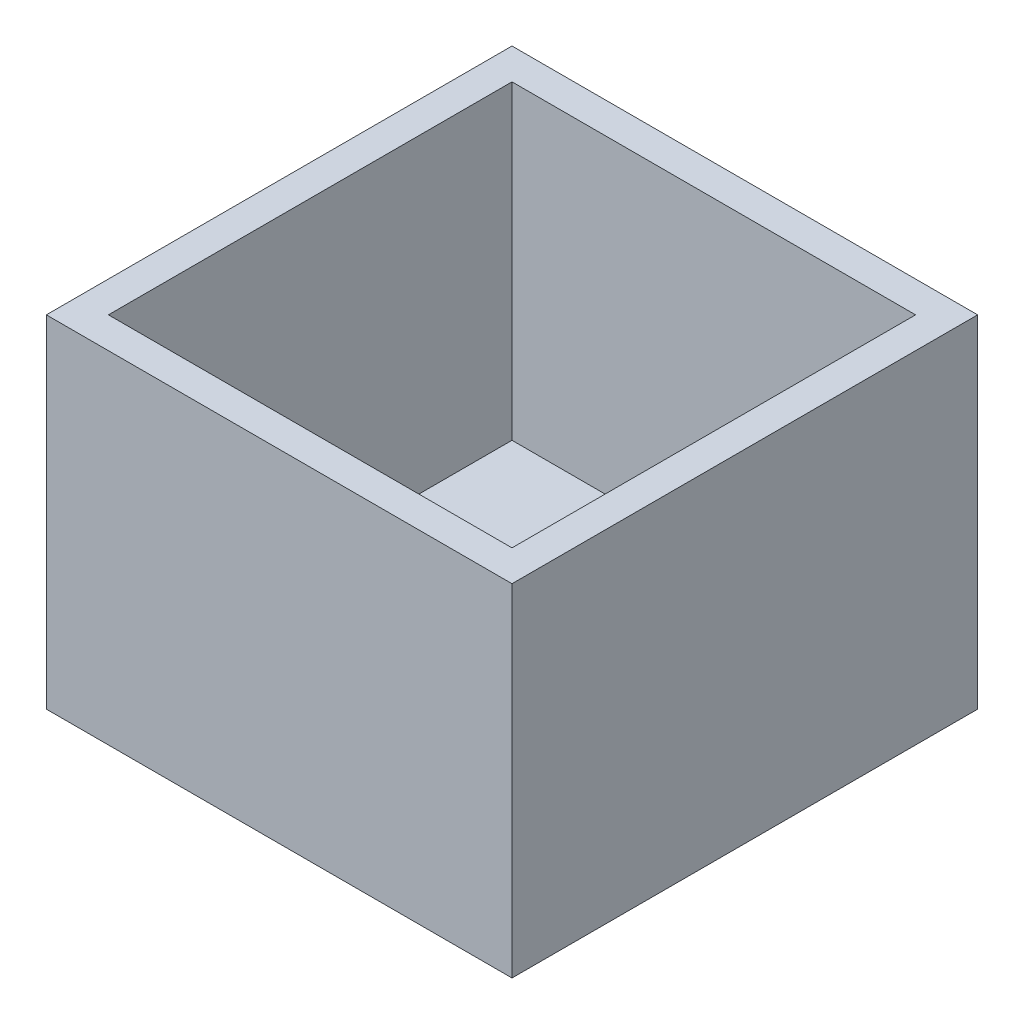
ISO-10303-21;
HEADER;
FILE_DESCRIPTION(('STEP AP214'),'2;1');
FILE_NAME('part.step','',(''),(''),'','','');
FILE_SCHEMA(('AUTOMOTIVE_DESIGN { 1 0 10303 214 1 1 1 1 }'));
ENDSEC;
DATA;
#1=APPLICATION_CONTEXT('core data for automotive mechanical design processes');
#2=APPLICATION_PROTOCOL_DEFINITION('international standard','automotive_design',2000,#1);
#3=PRODUCT_CONTEXT('',#1,'mechanical');
#4=PRODUCT('Part','Part','',(#3));
#5=PRODUCT_RELATED_PRODUCT_CATEGORY('part','',(#4));
#6=PRODUCT_DEFINITION_FORMATION('','',#4);
#7=PRODUCT_DEFINITION_CONTEXT('part definition',#1,'design');
#8=PRODUCT_DEFINITION('design','',#6,#7);
#9=PRODUCT_DEFINITION_SHAPE('','',#8);
#10=(LENGTH_UNIT() NAMED_UNIT(*) SI_UNIT(.MILLI.,.METRE.));
#11=(NAMED_UNIT(*) PLANE_ANGLE_UNIT() SI_UNIT($,.RADIAN.));
#12=(NAMED_UNIT(*) SI_UNIT($,.STERADIAN.) SOLID_ANGLE_UNIT());
#13=UNCERTAINTY_MEASURE_WITH_UNIT(LENGTH_MEASURE(1.E-05),#10,'distance_accuracy_value','');
#14=(GEOMETRIC_REPRESENTATION_CONTEXT(3) GLOBAL_UNCERTAINTY_ASSIGNED_CONTEXT((#13)) GLOBAL_UNIT_ASSIGNED_CONTEXT((#10,
#11,#12)) REPRESENTATION_CONTEXT('',''));
#15=CARTESIAN_POINT('',(0.,0.,0.));
#16=DIRECTION('',(0.,0.,1.));
#17=DIRECTION('',(1.,0.,0.));
#18=AXIS2_PLACEMENT_3D('',#15,#16,#17);
#19=CARTESIAN_POINT('',(0.,10.,0.));
#20=DIRECTION('',(0.,-1.,0.));
#21=DIRECTION('',(0.,0.,-1.));
#22=AXIS2_PLACEMENT_3D('',#19,#20,#21);
#23=PLANE('',#22);
#24=DIRECTION('',(0.,0.,-1.));
#25=VECTOR('',#24,1.);
#26=CARTESIAN_POINT('',(7.5,10.,7.5));
#27=LINE('',#26,#25);
#28=CARTESIAN_POINT('',(7.5,10.,7.5));
#29=VERTEX_POINT('',#28);
#30=CARTESIAN_POINT('',(7.5,10.,-7.5));
#31=VERTEX_POINT('',#30);
#32=EDGE_CURVE('E173',#29,#31,#27,.T.);
#33=ORIENTED_EDGE('',*,*,#32,.T.);
#34=DIRECTION('',(-1.,0.,0.));
#35=VECTOR('',#34,1.);
#36=CARTESIAN_POINT('',(-7.5,10.,-7.5));
#37=LINE('',#36,#35);
#38=CARTESIAN_POINT('',(-7.5,10.,-7.5));
#39=VERTEX_POINT('',#38);
#40=EDGE_CURVE('E111',#31,#39,#37,.T.);
#41=ORIENTED_EDGE('',*,*,#40,.T.);
#42=DIRECTION('',(0.,0.,1.));
#43=VECTOR('',#42,1.);
#44=CARTESIAN_POINT('',(-7.5,10.,7.5));
#45=LINE('',#44,#43);
#46=CARTESIAN_POINT('',(-7.5,10.,7.5));
#47=VERTEX_POINT('',#46);
#48=EDGE_CURVE('E178',#39,#47,#45,.T.);
#49=ORIENTED_EDGE('',*,*,#48,.T.);
#50=DIRECTION('',(1.,0.,0.));
#51=VECTOR('',#50,1.);
#52=CARTESIAN_POINT('',(-7.5,10.,7.5));
#53=LINE('',#52,#51);
#54=EDGE_CURVE('E181',#47,#29,#53,.T.);
#55=ORIENTED_EDGE('',*,*,#54,.T.);
#56=EDGE_LOOP('',(#33,#41,#49,#55));
#57=FACE_BOUND('',#56,.T.);
#58=DIRECTION('',(0.,0.,-1.));
#59=VECTOR('',#58,1.);
#60=CARTESIAN_POINT('',(6.5,10.,6.5));
#61=LINE('',#60,#59);
#62=CARTESIAN_POINT('',(6.5,10.,6.5));
#63=VERTEX_POINT('',#62);
#64=CARTESIAN_POINT('',(6.5,10.,-6.5));
#65=VERTEX_POINT('',#64);
#66=EDGE_CURVE('E136',#63,#65,#61,.T.);
#67=ORIENTED_EDGE('',*,*,#66,.F.);
#68=DIRECTION('',(1.,0.,0.));
#69=VECTOR('',#68,1.);
#70=CARTESIAN_POINT('',(-6.5,10.,6.5));
#71=LINE('',#70,#69);
#72=CARTESIAN_POINT('',(-6.5,10.,6.5));
#73=VERTEX_POINT('',#72);
#74=EDGE_CURVE('E146',#73,#63,#71,.T.);
#75=ORIENTED_EDGE('',*,*,#74,.F.);
#76=DIRECTION('',(0.,0.,1.));
#77=VECTOR('',#76,1.);
#78=CARTESIAN_POINT('',(-6.5,10.,6.5));
#79=LINE('',#78,#77);
#80=CARTESIAN_POINT('',(-6.5,10.,-6.5));
#81=VERTEX_POINT('',#80);
#82=EDGE_CURVE('E143',#81,#73,#79,.T.);
#83=ORIENTED_EDGE('',*,*,#82,.F.);
#84=DIRECTION('',(-1.,0.,0.));
#85=VECTOR('',#84,1.);
#86=CARTESIAN_POINT('',(-6.5,10.,-6.5));
#87=LINE('',#86,#85);
#88=EDGE_CURVE('E139',#65,#81,#87,.T.);
#89=ORIENTED_EDGE('',*,*,#88,.F.);
#90=EDGE_LOOP('',(#67,#75,#83,#89));
#91=FACE_BOUND('',#90,.T.);
#92=ADVANCED_FACE('F39',(#57,#91),#23,.F.);
#93=CARTESIAN_POINT('',(7.5,10.,7.5));
#94=DIRECTION('',(-1.,0.,0.));
#95=DIRECTION('',(0.,0.,1.));
#96=AXIS2_PLACEMENT_3D('',#93,#94,#95);
#97=PLANE('',#96);
#98=DIRECTION('',(0.,-1.,0.));
#99=VECTOR('',#98,1.);
#100=CARTESIAN_POINT('',(7.5,10.,7.5));
#101=LINE('',#100,#99);
#102=CARTESIAN_POINT('',(7.5,-1.,7.5));
#103=VERTEX_POINT('',#102);
#104=EDGE_CURVE('E118',#29,#103,#101,.T.);
#105=ORIENTED_EDGE('',*,*,#104,.T.);
#106=DIRECTION('',(0.,0.,-1.));
#107=VECTOR('',#106,1.);
#108=CARTESIAN_POINT('',(7.5,-1.,22.5332963783729));
#109=LINE('',#108,#107);
#110=CARTESIAN_POINT('',(7.5,-1.,-7.5));
#111=VERTEX_POINT('',#110);
#112=EDGE_CURVE('E116',#103,#111,#109,.T.);
#113=ORIENTED_EDGE('',*,*,#112,.T.);
#114=DIRECTION('',(0.,-1.,0.));
#115=VECTOR('',#114,1.);
#116=CARTESIAN_POINT('',(7.5,10.,-7.5));
#117=LINE('',#116,#115);
#118=EDGE_CURVE('E11',#31,#111,#117,.T.);
#119=ORIENTED_EDGE('',*,*,#118,.F.);
#120=ORIENTED_EDGE('',*,*,#32,.F.);
#121=EDGE_LOOP('',(#105,#113,#119,#120));
#122=FACE_BOUND('',#121,.T.);
#123=ADVANCED_FACE('F41',(#122),#97,.F.);
#124=CARTESIAN_POINT('',(-7.5,10.,-7.5));
#125=DIRECTION('',(0.,0.,1.));
#126=DIRECTION('',(1.,0.,0.));
#127=AXIS2_PLACEMENT_3D('',#124,#125,#126);
#128=PLANE('',#127);
#129=ORIENTED_EDGE('',*,*,#118,.T.);
#130=DIRECTION('',(-1.,0.,0.));
#131=VECTOR('',#130,1.);
#132=CARTESIAN_POINT('',(7.5,-1.,-7.5));
#133=LINE('',#132,#131);
#134=CARTESIAN_POINT('',(-7.5,-1.,-7.5));
#135=VERTEX_POINT('',#134);
#136=EDGE_CURVE('E110',#111,#135,#133,.T.);
#137=ORIENTED_EDGE('',*,*,#136,.T.);
#138=DIRECTION('',(0.,-1.,0.));
#139=VECTOR('',#138,1.);
#140=CARTESIAN_POINT('',(-7.5,10.,-7.5));
#141=LINE('',#140,#139);
#142=EDGE_CURVE('E48',#39,#135,#141,.T.);
#143=ORIENTED_EDGE('',*,*,#142,.F.);
#144=ORIENTED_EDGE('',*,*,#40,.F.);
#145=EDGE_LOOP('',(#129,#137,#143,#144));
#146=FACE_BOUND('',#145,.T.);
#147=ADVANCED_FACE('F107',(#146),#128,.F.);
#148=CARTESIAN_POINT('',(-7.5,10.,7.5));
#149=DIRECTION('',(1.,0.,0.));
#150=DIRECTION('',(0.,0.,-1.));
#151=AXIS2_PLACEMENT_3D('',#148,#149,#150);
#152=PLANE('',#151);
#153=ORIENTED_EDGE('',*,*,#142,.T.);
#154=DIRECTION('',(0.,0.,-1.));
#155=VECTOR('',#154,1.);
#156=CARTESIAN_POINT('',(-7.5,-1.,22.5332963783729));
#157=LINE('',#156,#155);
#158=CARTESIAN_POINT('',(-7.5,-1.,7.5));
#159=VERTEX_POINT('',#158);
#160=EDGE_CURVE('E123',#159,#135,#157,.T.);
#161=ORIENTED_EDGE('',*,*,#160,.F.);
#162=DIRECTION('',(0.,-1.,0.));
#163=VECTOR('',#162,1.);
#164=CARTESIAN_POINT('',(-7.5,10.,7.5));
#165=LINE('',#164,#163);
#166=EDGE_CURVE('E186',#47,#159,#165,.T.);
#167=ORIENTED_EDGE('',*,*,#166,.F.);
#168=ORIENTED_EDGE('',*,*,#48,.F.);
#169=EDGE_LOOP('',(#153,#161,#167,#168));
#170=FACE_BOUND('',#169,.T.);
#171=ADVANCED_FACE('F191',(#170),#152,.F.);
#172=CARTESIAN_POINT('',(-7.5,10.,7.5));
#173=DIRECTION('',(0.,0.,-1.));
#174=DIRECTION('',(-1.,0.,0.));
#175=AXIS2_PLACEMENT_3D('',#172,#173,#174);
#176=PLANE('',#175);
#177=ORIENTED_EDGE('',*,*,#166,.T.);
#178=DIRECTION('',(1.,0.,0.));
#179=VECTOR('',#178,1.);
#180=CARTESIAN_POINT('',(7.5,-1.,7.5));
#181=LINE('',#180,#179);
#182=EDGE_CURVE('E132',#159,#103,#181,.T.);
#183=ORIENTED_EDGE('',*,*,#182,.T.);
#184=ORIENTED_EDGE('',*,*,#104,.F.);
#185=ORIENTED_EDGE('',*,*,#54,.F.);
#186=EDGE_LOOP('',(#177,#183,#184,#185));
#187=FACE_BOUND('',#186,.T.);
#188=ADVANCED_FACE('F197',(#187),#176,.F.);
#189=CARTESIAN_POINT('',(6.5,10.,6.5));
#190=DIRECTION('',(-1.,0.,0.));
#191=DIRECTION('',(0.,0.,1.));
#192=AXIS2_PLACEMENT_3D('',#189,#190,#191);
#193=PLANE('',#192);
#194=DIRECTION('',(0.,0.,-1.));
#195=VECTOR('',#194,1.);
#196=CARTESIAN_POINT('',(6.5,0.,6.5));
#197=LINE('',#196,#195);
#198=CARTESIAN_POINT('',(6.5,0.,6.5));
#199=VERTEX_POINT('',#198);
#200=CARTESIAN_POINT('',(6.5,0.,-6.5));
#201=VERTEX_POINT('',#200);
#202=EDGE_CURVE('E63',#199,#201,#197,.T.);
#203=ORIENTED_EDGE('',*,*,#202,.F.);
#204=DIRECTION('',(0.,-1.,0.));
#205=VECTOR('',#204,1.);
#206=CARTESIAN_POINT('',(6.5,10.,6.5));
#207=LINE('',#206,#205);
#208=EDGE_CURVE('E149',#63,#199,#207,.T.);
#209=ORIENTED_EDGE('',*,*,#208,.F.);
#210=ORIENTED_EDGE('',*,*,#66,.T.);
#211=DIRECTION('',(0.,-1.,0.));
#212=VECTOR('',#211,1.);
#213=CARTESIAN_POINT('',(6.5,10.,-6.5));
#214=LINE('',#213,#212);
#215=EDGE_CURVE('E170',#65,#201,#214,.T.);
#216=ORIENTED_EDGE('',*,*,#215,.T.);
#217=EDGE_LOOP('',(#203,#209,#210,#216));
#218=FACE_BOUND('',#217,.T.);
#219=ADVANCED_FACE('F199',(#218),#193,.T.);
#220=CARTESIAN_POINT('',(-6.5,10.,-6.5));
#221=DIRECTION('',(0.,0.,1.));
#222=DIRECTION('',(1.,0.,0.));
#223=AXIS2_PLACEMENT_3D('',#220,#221,#222);
#224=PLANE('',#223);
#225=DIRECTION('',(-1.,0.,0.));
#226=VECTOR('',#225,1.);
#227=CARTESIAN_POINT('',(-6.5,0.,-6.5));
#228=LINE('',#227,#226);
#229=CARTESIAN_POINT('',(-6.5,0.,-6.5));
#230=VERTEX_POINT('',#229);
#231=EDGE_CURVE('E152',#201,#230,#228,.T.);
#232=ORIENTED_EDGE('',*,*,#231,.F.);
#233=ORIENTED_EDGE('',*,*,#215,.F.);
#234=ORIENTED_EDGE('',*,*,#88,.T.);
#235=DIRECTION('',(0.,-1.,0.));
#236=VECTOR('',#235,1.);
#237=CARTESIAN_POINT('',(-6.5,10.,-6.5));
#238=LINE('',#237,#236);
#239=EDGE_CURVE('E167',#81,#230,#238,.T.);
#240=ORIENTED_EDGE('',*,*,#239,.T.);
#241=EDGE_LOOP('',(#232,#233,#234,#240));
#242=FACE_BOUND('',#241,.T.);
#243=ADVANCED_FACE('F206',(#242),#224,.T.);
#244=CARTESIAN_POINT('',(-6.5,10.,6.5));
#245=DIRECTION('',(1.,0.,0.));
#246=DIRECTION('',(0.,0.,-1.));
#247=AXIS2_PLACEMENT_3D('',#244,#245,#246);
#248=PLANE('',#247);
#249=DIRECTION('',(0.,0.,1.));
#250=VECTOR('',#249,1.);
#251=CARTESIAN_POINT('',(-6.5,0.,6.5));
#252=LINE('',#251,#250);
#253=CARTESIAN_POINT('',(-6.5,0.,6.5));
#254=VERTEX_POINT('',#253);
#255=EDGE_CURVE('E156',#230,#254,#252,.T.);
#256=ORIENTED_EDGE('',*,*,#255,.F.);
#257=ORIENTED_EDGE('',*,*,#239,.F.);
#258=ORIENTED_EDGE('',*,*,#82,.T.);
#259=DIRECTION('',(0.,-1.,0.));
#260=VECTOR('',#259,1.);
#261=CARTESIAN_POINT('',(-6.5,10.,6.5));
#262=LINE('',#261,#260);
#263=EDGE_CURVE('E55',#73,#254,#262,.T.);
#264=ORIENTED_EDGE('',*,*,#263,.T.);
#265=EDGE_LOOP('',(#256,#257,#258,#264));
#266=FACE_BOUND('',#265,.T.);
#267=ADVANCED_FACE('F218',(#266),#248,.T.);
#268=CARTESIAN_POINT('',(-6.5,10.,6.5));
#269=DIRECTION('',(0.,0.,-1.));
#270=DIRECTION('',(-1.,0.,0.));
#271=AXIS2_PLACEMENT_3D('',#268,#269,#270);
#272=PLANE('',#271);
#273=DIRECTION('',(1.,0.,0.));
#274=VECTOR('',#273,1.);
#275=CARTESIAN_POINT('',(-6.5,0.,6.5));
#276=LINE('',#275,#274);
#277=EDGE_CURVE('E140',#254,#199,#276,.T.);
#278=ORIENTED_EDGE('',*,*,#277,.F.);
#279=ORIENTED_EDGE('',*,*,#263,.F.);
#280=ORIENTED_EDGE('',*,*,#74,.T.);
#281=ORIENTED_EDGE('',*,*,#208,.T.);
#282=EDGE_LOOP('',(#278,#279,#280,#281));
#283=FACE_BOUND('',#282,.T.);
#284=ADVANCED_FACE('F222',(#283),#272,.T.);
#285=CARTESIAN_POINT('',(7.5,0.,22.5332963783729));
#286=DIRECTION('',(0.,1.,0.));
#287=DIRECTION('',(0.,0.,1.));
#288=AXIS2_PLACEMENT_3D('',#285,#286,#287);
#289=PLANE('',#288);
#290=ORIENTED_EDGE('',*,*,#255,.T.);
#291=ORIENTED_EDGE('',*,*,#277,.T.);
#292=ORIENTED_EDGE('',*,*,#202,.T.);
#293=ORIENTED_EDGE('',*,*,#231,.T.);
#294=EDGE_LOOP('',(#290,#291,#292,#293));
#295=FACE_BOUND('',#294,.T.);
#296=ADVANCED_FACE('F226',(#295),#289,.T.);
#297=CARTESIAN_POINT('',(7.5,-1.,22.5332963783729));
#298=DIRECTION('',(0.,-1.,0.));
#299=DIRECTION('',(0.,0.,-1.));
#300=AXIS2_PLACEMENT_3D('',#297,#298,#299);
#301=PLANE('',#300);
#302=ORIENTED_EDGE('',*,*,#182,.F.);
#303=ORIENTED_EDGE('',*,*,#160,.T.);
#304=ORIENTED_EDGE('',*,*,#136,.F.);
#305=ORIENTED_EDGE('',*,*,#112,.F.);
#306=EDGE_LOOP('',(#302,#303,#304,#305));
#307=FACE_BOUND('',#306,.T.);
#308=ADVANCED_FACE('F126',(#307),#301,.T.);
#309=CLOSED_SHELL('',(#92,#123,#147,#171,#188,#219,#243,#267,#284,#296,#308));
#310=MANIFOLD_SOLID_BREP('B2',#309);
#311=ADVANCED_BREP_SHAPE_REPRESENTATION('',(#18,#310),#14);
#312=SHAPE_DEFINITION_REPRESENTATION(#9,#311);
ENDSEC;
END-ISO-10303-21;
